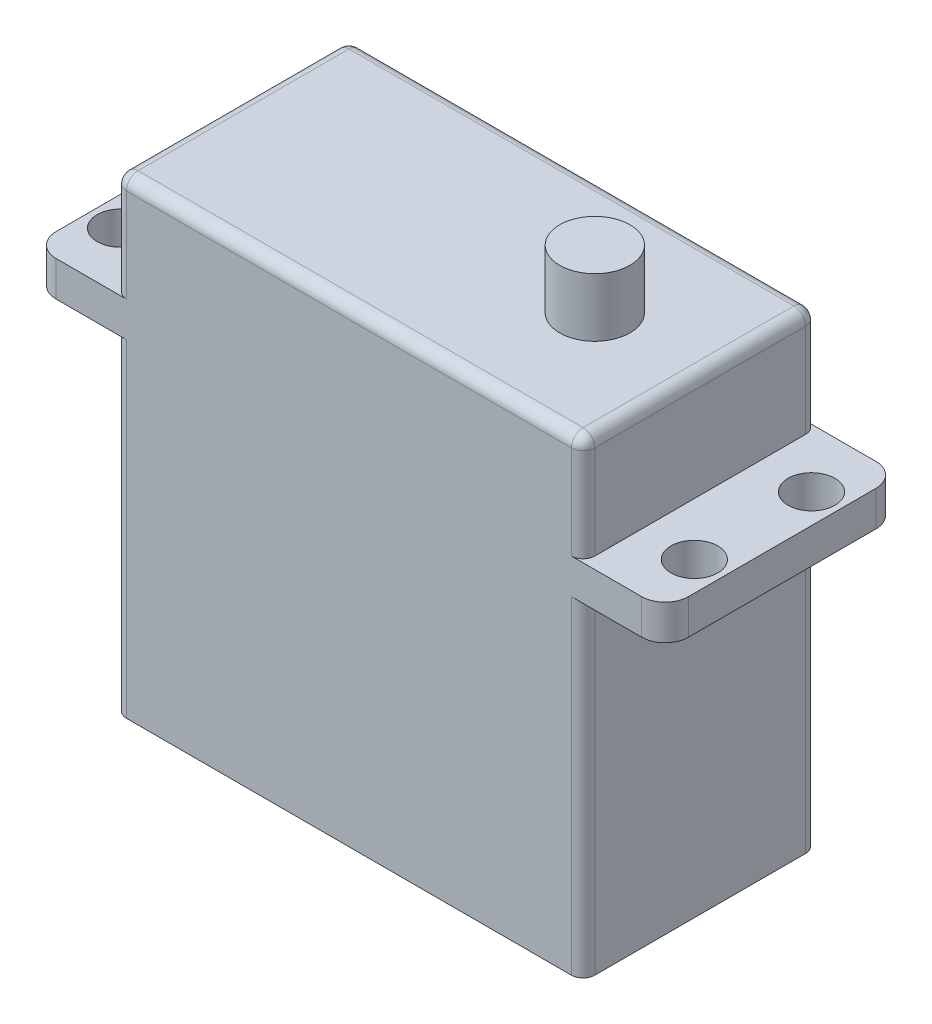
ISO-10303-21;
HEADER;
FILE_DESCRIPTION(('STEP AP214'),'2;1');
FILE_NAME('part.step','',(''),(''),'','','');
FILE_SCHEMA(('AUTOMOTIVE_DESIGN { 1 0 10303 214 1 1 1 1 }'));
ENDSEC;
DATA;
#1=APPLICATION_CONTEXT('core data for automotive mechanical design processes');
#2=APPLICATION_PROTOCOL_DEFINITION('international standard','automotive_design',2000,#1);
#3=PRODUCT_CONTEXT('',#1,'mechanical');
#4=PRODUCT('Part','Part','',(#3));
#5=PRODUCT_RELATED_PRODUCT_CATEGORY('part','',(#4));
#6=PRODUCT_DEFINITION_FORMATION('','',#4);
#7=PRODUCT_DEFINITION_CONTEXT('part definition',#1,'design');
#8=PRODUCT_DEFINITION('design','',#6,#7);
#9=PRODUCT_DEFINITION_SHAPE('','',#8);
#10=(LENGTH_UNIT() NAMED_UNIT(*) SI_UNIT(.MILLI.,.METRE.));
#11=(NAMED_UNIT(*) PLANE_ANGLE_UNIT() SI_UNIT($,.RADIAN.));
#12=(NAMED_UNIT(*) SI_UNIT($,.STERADIAN.) SOLID_ANGLE_UNIT());
#13=UNCERTAINTY_MEASURE_WITH_UNIT(LENGTH_MEASURE(1.E-05),#10,'distance_accuracy_value','');
#14=(GEOMETRIC_REPRESENTATION_CONTEXT(3) GLOBAL_UNCERTAINTY_ASSIGNED_CONTEXT((#13)) GLOBAL_UNIT_ASSIGNED_CONTEXT((#10,
#11,#12)) REPRESENTATION_CONTEXT('',''));
#15=CARTESIAN_POINT('',(0.,0.,0.));
#16=DIRECTION('',(0.,0.,1.));
#17=DIRECTION('',(1.,0.,0.));
#18=AXIS2_PLACEMENT_3D('',#15,#16,#17);
#19=CARTESIAN_POINT('',(20.,14.,20.));
#20=DIRECTION('',(-1.,0.,0.));
#21=DIRECTION('',(0.,-1.,0.));
#22=AXIS2_PLACEMENT_3D('',#19,#20,#21);
#23=PLANE('',#22);
#24=DIRECTION('',(0.,0.,-1.));
#25=VECTOR('',#24,1.);
#26=CARTESIAN_POINT('',(20.,-14.,20.));
#27=LINE('',#26,#25);
#28=CARTESIAN_POINT('',(20.,-14.,19.));
#29=VERTEX_POINT('',#28);
#30=CARTESIAN_POINT('',(20.,-14.,1.));
#31=VERTEX_POINT('',#30);
#32=EDGE_CURVE('E446',#29,#31,#27,.T.);
#33=ORIENTED_EDGE('',*,*,#32,.T.);
#34=DIRECTION('',(0.,1.,0.));
#35=VECTOR('',#34,1.);
#36=CARTESIAN_POINT('',(20.,14.,1.));
#37=LINE('',#36,#35);
#38=CARTESIAN_POINT('',(20.,14.,1.));
#39=VERTEX_POINT('',#38);
#40=EDGE_CURVE('E346',#31,#39,#37,.T.);
#41=ORIENTED_EDGE('',*,*,#40,.T.);
#42=DIRECTION('',(0.,0.,-1.));
#43=VECTOR('',#42,1.);
#44=CARTESIAN_POINT('',(20.,14.,20.));
#45=LINE('',#44,#43);
#46=CARTESIAN_POINT('',(20.,14.,19.));
#47=VERTEX_POINT('',#46);
#48=EDGE_CURVE('E251',#47,#39,#45,.T.);
#49=ORIENTED_EDGE('',*,*,#48,.F.);
#50=DIRECTION('',(0.,1.,0.));
#51=VECTOR('',#50,1.);
#52=CARTESIAN_POINT('',(20.,14.,19.));
#53=LINE('',#52,#51);
#54=EDGE_CURVE('E347',#47,#29,#53,.F.);
#55=ORIENTED_EDGE('',*,*,#54,.T.);
#56=EDGE_LOOP('',(#33,#41,#49,#55));
#57=FACE_BOUND('',#56,.T.);
#58=ADVANCED_FACE('F47',(#57),#23,.F.);
#59=CARTESIAN_POINT('',(20.,14.,20.));
#60=DIRECTION('',(0.,1.,0.));
#61=DIRECTION('',(0.,0.,1.));
#62=AXIS2_PLACEMENT_3D('',#59,#60,#61);
#63=PLANE('',#62);
#64=CARTESIAN_POINT('',(24.5,14.,5.));
#65=DIRECTION('',(0.,1.,0.));
#66=DIRECTION('',(0.,0.,1.));
#67=AXIS2_PLACEMENT_3D('',#64,#65,#66);
#68=CIRCLE('',#67,2.);
#69=CARTESIAN_POINT('',(24.5,14.,7.));
#70=VERTEX_POINT('',#69);
#71=EDGE_CURVE('E429',#70,#70,#68,.F.);
#72=ORIENTED_EDGE('',*,*,#71,.F.);
#73=EDGE_LOOP('',(#72));
#74=FACE_BOUND('',#73,.T.);
#75=CARTESIAN_POINT('',(24.5,14.,15.));
#76=DIRECTION('',(0.,1.,0.));
#77=DIRECTION('',(0.,0.,1.));
#78=AXIS2_PLACEMENT_3D('',#75,#76,#77);
#79=CIRCLE('',#78,2.);
#80=CARTESIAN_POINT('',(24.5,14.,17.));
#81=VERTEX_POINT('',#80);
#82=EDGE_CURVE('E1172',#81,#81,#79,.F.);
#83=ORIENTED_EDGE('',*,*,#82,.F.);
#84=EDGE_LOOP('',(#83));
#85=FACE_BOUND('',#84,.T.);
#86=DIRECTION('',(1.,0.,0.));
#87=VECTOR('',#86,1.);
#88=CARTESIAN_POINT('',(20.,14.,0.));
#89=LINE('',#88,#87);
#90=CARTESIAN_POINT('',(19.,14.,0.));
#91=VERTEX_POINT('',#90);
#92=CARTESIAN_POINT('',(25.,14.,0.));
#93=VERTEX_POINT('',#92);
#94=EDGE_CURVE('E423',#91,#93,#89,.T.);
#95=ORIENTED_EDGE('',*,*,#94,.T.);
#96=CARTESIAN_POINT('',(25.,14.,2.));
#97=DIRECTION('',(0.,1.,0.));
#98=DIRECTION('',(0.,0.,1.));
#99=AXIS2_PLACEMENT_3D('',#96,#97,#98);
#100=CIRCLE('',#99,2.);
#101=CARTESIAN_POINT('',(27.,14.,2.));
#102=VERTEX_POINT('',#101);
#103=EDGE_CURVE('E270',#93,#102,#100,.F.);
#104=ORIENTED_EDGE('',*,*,#103,.T.);
#105=DIRECTION('',(0.,0.,-1.));
#106=VECTOR('',#105,1.);
#107=CARTESIAN_POINT('',(27.,14.,20.));
#108=LINE('',#107,#106);
#109=CARTESIAN_POINT('',(27.,14.,18.));
#110=VERTEX_POINT('',#109);
#111=EDGE_CURVE('E250',#110,#102,#108,.T.);
#112=ORIENTED_EDGE('',*,*,#111,.F.);
#113=CARTESIAN_POINT('',(25.,14.,18.));
#114=DIRECTION('',(0.,1.,0.));
#115=DIRECTION('',(0.,0.,1.));
#116=AXIS2_PLACEMENT_3D('',#113,#114,#115);
#117=CIRCLE('',#116,2.);
#118=CARTESIAN_POINT('',(25.,14.,20.));
#119=VERTEX_POINT('',#118);
#120=EDGE_CURVE('E252',#110,#119,#117,.F.);
#121=ORIENTED_EDGE('',*,*,#120,.T.);
#122=DIRECTION('',(1.,0.,0.));
#123=VECTOR('',#122,1.);
#124=CARTESIAN_POINT('',(20.,14.,20.));
#125=LINE('',#124,#123);
#126=CARTESIAN_POINT('',(19.,14.,20.));
#127=VERTEX_POINT('',#126);
#128=EDGE_CURVE('E434',#127,#119,#125,.T.);
#129=ORIENTED_EDGE('',*,*,#128,.F.);
#130=CARTESIAN_POINT('',(19.,14.,19.));
#131=DIRECTION('',(0.,1.,0.));
#132=DIRECTION('',(0.,0.,1.));
#133=AXIS2_PLACEMENT_3D('',#130,#131,#132);
#134=CIRCLE('',#133,1.);
#135=EDGE_CURVE('E74',#127,#47,#134,.T.);
#136=ORIENTED_EDGE('',*,*,#135,.T.);
#137=ORIENTED_EDGE('',*,*,#48,.T.);
#138=CARTESIAN_POINT('',(19.,14.,1.));
#139=DIRECTION('',(0.,1.,0.));
#140=DIRECTION('',(0.,0.,1.));
#141=AXIS2_PLACEMENT_3D('',#138,#139,#140);
#142=CIRCLE('',#141,1.);
#143=EDGE_CURVE('E66',#39,#91,#142,.T.);
#144=ORIENTED_EDGE('',*,*,#143,.T.);
#145=EDGE_LOOP('',(#95,#104,#112,#121,#129,#136,#137,#144));
#146=FACE_BOUND('',#145,.T.);
#147=ADVANCED_FACE('F522',(#74,#85,#146),#63,.F.);
#148=CARTESIAN_POINT('',(27.,14.,20.));
#149=DIRECTION('',(-1.,0.,0.));
#150=DIRECTION('',(0.,0.,1.));
#151=AXIS2_PLACEMENT_3D('',#148,#149,#150);
#152=PLANE('',#151);
#153=ORIENTED_EDGE('',*,*,#111,.T.);
#154=DIRECTION('',(0.,1.,0.));
#155=VECTOR('',#154,1.);
#156=CARTESIAN_POINT('',(27.,17.,2.));
#157=LINE('',#156,#155);
#158=CARTESIAN_POINT('',(27.,17.,2.));
#159=VERTEX_POINT('',#158);
#160=EDGE_CURVE('E236',#102,#159,#157,.T.);
#161=ORIENTED_EDGE('',*,*,#160,.T.);
#162=DIRECTION('',(0.,0.,-1.));
#163=VECTOR('',#162,1.);
#164=CARTESIAN_POINT('',(27.,17.,20.));
#165=LINE('',#164,#163);
#166=CARTESIAN_POINT('',(27.,17.,18.));
#167=VERTEX_POINT('',#166);
#168=EDGE_CURVE('E227',#167,#159,#165,.T.);
#169=ORIENTED_EDGE('',*,*,#168,.F.);
#170=DIRECTION('',(0.,1.,0.));
#171=VECTOR('',#170,1.);
#172=CARTESIAN_POINT('',(27.,14.,18.));
#173=LINE('',#172,#171);
#174=EDGE_CURVE('E244',#167,#110,#173,.F.);
#175=ORIENTED_EDGE('',*,*,#174,.T.);
#176=EDGE_LOOP('',(#153,#161,#169,#175));
#177=FACE_BOUND('',#176,.T.);
#178=ADVANCED_FACE('F241',(#177),#152,.F.);
#179=CARTESIAN_POINT('',(20.,17.,20.));
#180=DIRECTION('',(0.,-1.,0.));
#181=DIRECTION('',(0.,0.,-1.));
#182=AXIS2_PLACEMENT_3D('',#179,#180,#181);
#183=PLANE('',#182);
#184=CARTESIAN_POINT('',(24.5,17.,5.));
#185=DIRECTION('',(0.,-1.,0.));
#186=DIRECTION('',(0.,0.,1.));
#187=AXIS2_PLACEMENT_3D('',#184,#185,#186);
#188=CIRCLE('',#187,2.);
#189=CARTESIAN_POINT('',(24.5,17.,7.));
#190=VERTEX_POINT('',#189);
#191=EDGE_CURVE('E1170',#190,#190,#188,.T.);
#192=ORIENTED_EDGE('',*,*,#191,.T.);
#193=EDGE_LOOP('',(#192));
#194=FACE_BOUND('',#193,.T.);
#195=CARTESIAN_POINT('',(24.5,17.,15.));
#196=DIRECTION('',(0.,-1.,0.));
#197=DIRECTION('',(0.,0.,1.));
#198=AXIS2_PLACEMENT_3D('',#195,#196,#197);
#199=CIRCLE('',#198,2.);
#200=CARTESIAN_POINT('',(24.5,17.,17.));
#201=VERTEX_POINT('',#200);
#202=EDGE_CURVE('E380',#201,#201,#199,.T.);
#203=ORIENTED_EDGE('',*,*,#202,.T.);
#204=EDGE_LOOP('',(#203));
#205=FACE_BOUND('',#204,.T.);
#206=ORIENTED_EDGE('',*,*,#168,.T.);
#207=CARTESIAN_POINT('',(25.,17.,2.));
#208=DIRECTION('',(0.,-1.,0.));
#209=DIRECTION('',(0.,0.,-1.));
#210=AXIS2_PLACEMENT_3D('',#207,#208,#209);
#211=CIRCLE('',#210,2.);
#212=CARTESIAN_POINT('',(25.,17.,0.));
#213=VERTEX_POINT('',#212);
#214=EDGE_CURVE('E240',#159,#213,#211,.F.);
#215=ORIENTED_EDGE('',*,*,#214,.T.);
#216=DIRECTION('',(-1.,0.,0.));
#217=VECTOR('',#216,1.);
#218=CARTESIAN_POINT('',(20.,17.,0.));
#219=LINE('',#218,#217);
#220=CARTESIAN_POINT('',(19.,17.,0.));
#221=VERTEX_POINT('',#220);
#222=EDGE_CURVE('E451',#213,#221,#219,.T.);
#223=ORIENTED_EDGE('',*,*,#222,.T.);
#224=CARTESIAN_POINT('',(19.,17.,1.));
#225=DIRECTION('',(0.,-1.,0.));
#226=DIRECTION('',(0.,0.,-1.));
#227=AXIS2_PLACEMENT_3D('',#224,#225,#226);
#228=CIRCLE('',#227,1.);
#229=CARTESIAN_POINT('',(20.,17.,1.));
#230=VERTEX_POINT('',#229);
#231=EDGE_CURVE('E360',#221,#230,#228,.T.);
#232=ORIENTED_EDGE('',*,*,#231,.T.);
#233=DIRECTION('',(0.,0.,-1.));
#234=VECTOR('',#233,1.);
#235=CARTESIAN_POINT('',(20.,17.,20.));
#236=LINE('',#235,#234);
#237=CARTESIAN_POINT('',(20.,17.,19.));
#238=VERTEX_POINT('',#237);
#239=EDGE_CURVE('E247',#238,#230,#236,.T.);
#240=ORIENTED_EDGE('',*,*,#239,.F.);
#241=CARTESIAN_POINT('',(19.,17.,19.));
#242=DIRECTION('',(0.,-1.,0.));
#243=DIRECTION('',(0.,0.,-1.));
#244=AXIS2_PLACEMENT_3D('',#241,#242,#243);
#245=CIRCLE('',#244,1.);
#246=CARTESIAN_POINT('',(19.,17.,20.));
#247=VERTEX_POINT('',#246);
#248=EDGE_CURVE('E359',#238,#247,#245,.T.);
#249=ORIENTED_EDGE('',*,*,#248,.T.);
#250=DIRECTION('',(-1.,0.,0.));
#251=VECTOR('',#250,1.);
#252=CARTESIAN_POINT('',(20.,17.,20.));
#253=LINE('',#252,#251);
#254=CARTESIAN_POINT('',(25.,17.,20.));
#255=VERTEX_POINT('',#254);
#256=EDGE_CURVE('E235',#255,#247,#253,.T.);
#257=ORIENTED_EDGE('',*,*,#256,.F.);
#258=CARTESIAN_POINT('',(25.,17.,18.));
#259=DIRECTION('',(0.,-1.,0.));
#260=DIRECTION('',(0.,0.,-1.));
#261=AXIS2_PLACEMENT_3D('',#258,#259,#260);
#262=CIRCLE('',#261,2.);
#263=EDGE_CURVE('E230',#255,#167,#262,.F.);
#264=ORIENTED_EDGE('',*,*,#263,.T.);
#265=EDGE_LOOP('',(#206,#215,#223,#232,#240,#249,#257,#264));
#266=FACE_BOUND('',#265,.T.);
#267=ADVANCED_FACE('F229',(#194,#205,#266),#183,.F.);
#268=CARTESIAN_POINT('',(20.,17.,20.));
#269=DIRECTION('',(-1.,0.,0.));
#270=DIRECTION('',(0.,0.,1.));
#271=AXIS2_PLACEMENT_3D('',#268,#269,#270);
#272=PLANE('',#271);
#273=ORIENTED_EDGE('',*,*,#239,.T.);
#274=DIRECTION('',(0.,1.,0.));
#275=VECTOR('',#274,1.);
#276=CARTESIAN_POINT('',(20.,25.,1.));
#277=LINE('',#276,#275);
#278=CARTESIAN_POINT('',(20.,25.,1.));
#279=VERTEX_POINT('',#278);
#280=EDGE_CURVE('E343',#230,#279,#277,.T.);
#281=ORIENTED_EDGE('',*,*,#280,.T.);
#282=DIRECTION('',(0.,0.,-1.));
#283=VECTOR('',#282,1.);
#284=CARTESIAN_POINT('',(20.,25.,20.));
#285=LINE('',#284,#283);
#286=CARTESIAN_POINT('',(20.,25.,19.));
#287=VERTEX_POINT('',#286);
#288=EDGE_CURVE('E410',#287,#279,#285,.T.);
#289=ORIENTED_EDGE('',*,*,#288,.F.);
#290=DIRECTION('',(0.,1.,0.));
#291=VECTOR('',#290,1.);
#292=CARTESIAN_POINT('',(20.,17.,19.));
#293=LINE('',#292,#291);
#294=EDGE_CURVE('E345',#287,#238,#293,.F.);
#295=ORIENTED_EDGE('',*,*,#294,.T.);
#296=EDGE_LOOP('',(#273,#281,#289,#295));
#297=FACE_BOUND('',#296,.T.);
#298=ADVANCED_FACE('F404',(#297),#272,.F.);
#299=CARTESIAN_POINT('',(19.,25.,20.));
#300=DIRECTION('',(0.,0.,-1.));
#301=DIRECTION('',(-1.,0.,0.));
#302=AXIS2_PLACEMENT_3D('',#299,#300,#301);
#303=CYLINDRICAL_SURFACE('',#302,1.);
#304=ORIENTED_EDGE('',*,*,#288,.T.);
#305=CARTESIAN_POINT('',(19.,25.,1.));
#306=DIRECTION('',(0.,0.,-1.));
#307=DIRECTION('',(-1.,0.,0.));
#308=AXIS2_PLACEMENT_3D('',#305,#306,#307);
#309=CIRCLE('',#308,1.);
#310=CARTESIAN_POINT('',(19.,26.,1.));
#311=VERTEX_POINT('',#310);
#312=EDGE_CURVE('E314',#279,#311,#309,.F.);
#313=ORIENTED_EDGE('',*,*,#312,.T.);
#314=DIRECTION('',(0.,0.,-1.));
#315=VECTOR('',#314,1.);
#316=CARTESIAN_POINT('',(19.,26.,20.));
#317=LINE('',#316,#315);
#318=CARTESIAN_POINT('',(19.,26.,19.));
#319=VERTEX_POINT('',#318);
#320=EDGE_CURVE('E411',#319,#311,#317,.T.);
#321=ORIENTED_EDGE('',*,*,#320,.F.);
#322=CARTESIAN_POINT('',(19.,25.,19.));
#323=DIRECTION('',(0.,0.,-1.));
#324=DIRECTION('',(-1.,0.,0.));
#325=AXIS2_PLACEMENT_3D('',#322,#323,#324);
#326=CIRCLE('',#325,1.);
#327=EDGE_CURVE('E315',#319,#287,#326,.T.);
#328=ORIENTED_EDGE('',*,*,#327,.T.);
#329=EDGE_LOOP('',(#304,#313,#321,#328));
#330=FACE_BOUND('',#329,.T.);
#331=ADVANCED_FACE('F546',(#330),#303,.T.);
#332=CARTESIAN_POINT('',(-19.,26.,20.));
#333=DIRECTION('',(0.,-1.,0.));
#334=DIRECTION('',(0.,0.,-1.));
#335=AXIS2_PLACEMENT_3D('',#332,#333,#334);
#336=PLANE('',#335);
#337=CARTESIAN_POINT('',(11.,26.,10.));
#338=DIRECTION('',(0.,1.,0.));
#339=DIRECTION('',(0.,0.,1.));
#340=AXIS2_PLACEMENT_3D('',#337,#338,#339);
#341=CIRCLE('',#340,3.);
#342=CARTESIAN_POINT('',(11.,26.,13.));
#343=VERTEX_POINT('',#342);
#344=EDGE_CURVE('E11',#343,#343,#341,.T.);
#345=ORIENTED_EDGE('',*,*,#344,.F.);
#346=EDGE_LOOP('',(#345));
#347=FACE_BOUND('',#346,.T.);
#348=ORIENTED_EDGE('',*,*,#320,.T.);
#349=DIRECTION('',(-1.,0.,0.));
#350=VECTOR('',#349,1.);
#351=CARTESIAN_POINT('',(-19.,26.,1.));
#352=LINE('',#351,#350);
#353=CARTESIAN_POINT('',(-19.,26.,1.));
#354=VERTEX_POINT('',#353);
#355=EDGE_CURVE('E309',#311,#354,#352,.T.);
#356=ORIENTED_EDGE('',*,*,#355,.T.);
#357=DIRECTION('',(0.,0.,-1.));
#358=VECTOR('',#357,1.);
#359=CARTESIAN_POINT('',(-19.,26.,20.));
#360=LINE('',#359,#358);
#361=CARTESIAN_POINT('',(-19.,26.,19.));
#362=VERTEX_POINT('',#361);
#363=EDGE_CURVE('E477',#362,#354,#360,.T.);
#364=ORIENTED_EDGE('',*,*,#363,.F.);
#365=DIRECTION('',(-1.,0.,0.));
#366=VECTOR('',#365,1.);
#367=CARTESIAN_POINT('',(-19.,26.,19.));
#368=LINE('',#367,#366);
#369=EDGE_CURVE('E306',#362,#319,#368,.F.);
#370=ORIENTED_EDGE('',*,*,#369,.T.);
#371=EDGE_LOOP('',(#348,#356,#364,#370));
#372=FACE_BOUND('',#371,.T.);
#373=ADVANCED_FACE('F486',(#347,#372),#336,.F.);
#374=CARTESIAN_POINT('',(-19.,25.,20.));
#375=DIRECTION('',(0.,0.,-1.));
#376=DIRECTION('',(-1.,0.,0.));
#377=AXIS2_PLACEMENT_3D('',#374,#375,#376);
#378=CYLINDRICAL_SURFACE('',#377,1.);
#379=ORIENTED_EDGE('',*,*,#363,.T.);
#380=CARTESIAN_POINT('',(-19.,25.,1.));
#381=DIRECTION('',(0.,0.,-1.));
#382=DIRECTION('',(-1.,0.,0.));
#383=AXIS2_PLACEMENT_3D('',#380,#381,#382);
#384=CIRCLE('',#383,1.);
#385=CARTESIAN_POINT('',(-20.,25.,1.));
#386=VERTEX_POINT('',#385);
#387=EDGE_CURVE('E308',#354,#386,#384,.F.);
#388=ORIENTED_EDGE('',*,*,#387,.T.);
#389=DIRECTION('',(0.,0.,-1.));
#390=VECTOR('',#389,1.);
#391=CARTESIAN_POINT('',(-20.,25.,20.));
#392=LINE('',#391,#390);
#393=CARTESIAN_POINT('',(-20.,25.,19.));
#394=VERTEX_POINT('',#393);
#395=EDGE_CURVE('E480',#394,#386,#392,.T.);
#396=ORIENTED_EDGE('',*,*,#395,.F.);
#397=CARTESIAN_POINT('',(-19.,25.,19.));
#398=DIRECTION('',(0.,0.,-1.));
#399=DIRECTION('',(-1.,0.,0.));
#400=AXIS2_PLACEMENT_3D('',#397,#398,#399);
#401=CIRCLE('',#400,1.);
#402=EDGE_CURVE('E303',#394,#362,#401,.T.);
#403=ORIENTED_EDGE('',*,*,#402,.T.);
#404=EDGE_LOOP('',(#379,#388,#396,#403));
#405=FACE_BOUND('',#404,.T.);
#406=ADVANCED_FACE('F502',(#405),#378,.T.);
#407=CARTESIAN_POINT('',(-20.,17.,20.));
#408=DIRECTION('',(1.,0.,0.));
#409=DIRECTION('',(0.,0.,-1.));
#410=AXIS2_PLACEMENT_3D('',#407,#408,#409);
#411=PLANE('',#410);
#412=ORIENTED_EDGE('',*,*,#395,.T.);
#413=DIRECTION('',(0.,-1.,0.));
#414=VECTOR('',#413,1.);
#415=CARTESIAN_POINT('',(-20.,17.,1.));
#416=LINE('',#415,#414);
#417=CARTESIAN_POINT('',(-20.,17.,1.));
#418=VERTEX_POINT('',#417);
#419=EDGE_CURVE('E288',#386,#418,#416,.T.);
#420=ORIENTED_EDGE('',*,*,#419,.T.);
#421=DIRECTION('',(0.,0.,-1.));
#422=VECTOR('',#421,1.);
#423=CARTESIAN_POINT('',(-20.,17.,20.));
#424=LINE('',#423,#422);
#425=CARTESIAN_POINT('',(-20.,17.,19.));
#426=VERTEX_POINT('',#425);
#427=EDGE_CURVE('E475',#426,#418,#424,.T.);
#428=ORIENTED_EDGE('',*,*,#427,.F.);
#429=DIRECTION('',(0.,-1.,0.));
#430=VECTOR('',#429,1.);
#431=CARTESIAN_POINT('',(-20.,17.,19.));
#432=LINE('',#431,#430);
#433=EDGE_CURVE('E290',#426,#394,#432,.F.);
#434=ORIENTED_EDGE('',*,*,#433,.T.);
#435=EDGE_LOOP('',(#412,#420,#428,#434));
#436=FACE_BOUND('',#435,.T.);
#437=ADVANCED_FACE('F507',(#436),#411,.F.);
#438=CARTESIAN_POINT('',(-27.,17.,20.));
#439=DIRECTION('',(0.,-1.,0.));
#440=DIRECTION('',(0.,0.,-1.));
#441=AXIS2_PLACEMENT_3D('',#438,#439,#440);
#442=PLANE('',#441);
#443=CARTESIAN_POINT('',(-24.5,17.,5.));
#444=DIRECTION('',(0.,1.,0.));
#445=DIRECTION('',(0.,0.,1.));
#446=AXIS2_PLACEMENT_3D('',#443,#444,#445);
#447=CIRCLE('',#446,2.);
#448=CARTESIAN_POINT('',(-24.5,17.,7.));
#449=VERTEX_POINT('',#448);
#450=EDGE_CURVE('E417',#449,#449,#447,.T.);
#451=ORIENTED_EDGE('',*,*,#450,.F.);
#452=EDGE_LOOP('',(#451));
#453=FACE_BOUND('',#452,.T.);
#454=CARTESIAN_POINT('',(-24.5,17.,15.));
#455=DIRECTION('',(0.,1.,0.));
#456=DIRECTION('',(0.,0.,1.));
#457=AXIS2_PLACEMENT_3D('',#454,#455,#456);
#458=CIRCLE('',#457,2.);
#459=CARTESIAN_POINT('',(-24.5,17.,17.));
#460=VERTEX_POINT('',#459);
#461=EDGE_CURVE('E424',#460,#460,#458,.T.);
#462=ORIENTED_EDGE('',*,*,#461,.F.);
#463=EDGE_LOOP('',(#462));
#464=FACE_BOUND('',#463,.T.);
#465=DIRECTION('',(-1.,0.,0.));
#466=VECTOR('',#465,1.);
#467=CARTESIAN_POINT('',(-27.,17.,0.));
#468=LINE('',#467,#466);
#469=CARTESIAN_POINT('',(-19.,17.,0.));
#470=VERTEX_POINT('',#469);
#471=CARTESIAN_POINT('',(-25.,17.,0.));
#472=VERTEX_POINT('',#471);
#473=EDGE_CURVE('E452',#470,#472,#468,.T.);
#474=ORIENTED_EDGE('',*,*,#473,.T.);
#475=CARTESIAN_POINT('',(-25.,17.,2.));
#476=DIRECTION('',(0.,-1.,0.));
#477=DIRECTION('',(0.,0.,-1.));
#478=AXIS2_PLACEMENT_3D('',#475,#476,#477);
#479=CIRCLE('',#478,2.);
#480=CARTESIAN_POINT('',(-27.,17.,2.));
#481=VERTEX_POINT('',#480);
#482=EDGE_CURVE('E282',#472,#481,#479,.F.);
#483=ORIENTED_EDGE('',*,*,#482,.T.);
#484=DIRECTION('',(0.,0.,-1.));
#485=VECTOR('',#484,1.);
#486=CARTESIAN_POINT('',(-27.,17.,20.));
#487=LINE('',#486,#485);
#488=CARTESIAN_POINT('',(-27.,17.,18.));
#489=VERTEX_POINT('',#488);
#490=EDGE_CURVE('E473',#489,#481,#487,.T.);
#491=ORIENTED_EDGE('',*,*,#490,.F.);
#492=CARTESIAN_POINT('',(-25.,17.,18.));
#493=DIRECTION('',(0.,-1.,0.));
#494=DIRECTION('',(0.,0.,-1.));
#495=AXIS2_PLACEMENT_3D('',#492,#493,#494);
#496=CIRCLE('',#495,2.);
#497=CARTESIAN_POINT('',(-25.,17.,20.));
#498=VERTEX_POINT('',#497);
#499=EDGE_CURVE('E281',#489,#498,#496,.F.);
#500=ORIENTED_EDGE('',*,*,#499,.T.);
#501=DIRECTION('',(-1.,0.,0.));
#502=VECTOR('',#501,1.);
#503=CARTESIAN_POINT('',(-27.,17.,20.));
#504=LINE('',#503,#502);
#505=CARTESIAN_POINT('',(-19.,17.,20.));
#506=VERTEX_POINT('',#505);
#507=EDGE_CURVE('E439',#506,#498,#504,.T.);
#508=ORIENTED_EDGE('',*,*,#507,.F.);
#509=CARTESIAN_POINT('',(-19.,17.,19.));
#510=DIRECTION('',(0.,-1.,0.));
#511=DIRECTION('',(0.,0.,-1.));
#512=AXIS2_PLACEMENT_3D('',#509,#510,#511);
#513=CIRCLE('',#512,1.);
#514=EDGE_CURVE('E351',#506,#426,#513,.T.);
#515=ORIENTED_EDGE('',*,*,#514,.T.);
#516=ORIENTED_EDGE('',*,*,#427,.T.);
#517=CARTESIAN_POINT('',(-19.,17.,1.));
#518=DIRECTION('',(0.,-1.,0.));
#519=DIRECTION('',(0.,0.,-1.));
#520=AXIS2_PLACEMENT_3D('',#517,#518,#519);
#521=CIRCLE('',#520,1.);
#522=EDGE_CURVE('E348',#418,#470,#521,.T.);
#523=ORIENTED_EDGE('',*,*,#522,.T.);
#524=EDGE_LOOP('',(#474,#483,#491,#500,#508,#515,#516,#523));
#525=FACE_BOUND('',#524,.T.);
#526=ADVANCED_FACE('F638',(#453,#464,#525),#442,.F.);
#527=CARTESIAN_POINT('',(-27.,14.,20.));
#528=DIRECTION('',(1.,0.,0.));
#529=DIRECTION('',(0.,0.,-1.));
#530=AXIS2_PLACEMENT_3D('',#527,#528,#529);
#531=PLANE('',#530);
#532=ORIENTED_EDGE('',*,*,#490,.T.);
#533=DIRECTION('',(0.,-1.,0.));
#534=VECTOR('',#533,1.);
#535=CARTESIAN_POINT('',(-27.,14.,2.));
#536=LINE('',#535,#534);
#537=CARTESIAN_POINT('',(-27.,14.,2.));
#538=VERTEX_POINT('',#537);
#539=EDGE_CURVE('E277',#481,#538,#536,.T.);
#540=ORIENTED_EDGE('',*,*,#539,.T.);
#541=DIRECTION('',(0.,0.,-1.));
#542=VECTOR('',#541,1.);
#543=CARTESIAN_POINT('',(-27.,14.,20.));
#544=LINE('',#543,#542);
#545=CARTESIAN_POINT('',(-27.,14.,18.));
#546=VERTEX_POINT('',#545);
#547=EDGE_CURVE('E467',#546,#538,#544,.T.);
#548=ORIENTED_EDGE('',*,*,#547,.F.);
#549=DIRECTION('',(0.,-1.,0.));
#550=VECTOR('',#549,1.);
#551=CARTESIAN_POINT('',(-27.,14.,18.));
#552=LINE('',#551,#550);
#553=EDGE_CURVE('E273',#546,#489,#552,.F.);
#554=ORIENTED_EDGE('',*,*,#553,.T.);
#555=EDGE_LOOP('',(#532,#540,#548,#554));
#556=FACE_BOUND('',#555,.T.);
#557=ADVANCED_FACE('F640',(#556),#531,.F.);
#558=CARTESIAN_POINT('',(-27.,14.,20.));
#559=DIRECTION('',(0.,1.,0.));
#560=DIRECTION('',(0.,0.,1.));
#561=AXIS2_PLACEMENT_3D('',#558,#559,#560);
#562=PLANE('',#561);
#563=CARTESIAN_POINT('',(-24.5,14.,5.));
#564=DIRECTION('',(0.,1.,0.));
#565=DIRECTION('',(0.,0.,1.));
#566=AXIS2_PLACEMENT_3D('',#563,#564,#565);
#567=CIRCLE('',#566,2.);
#568=CARTESIAN_POINT('',(-24.5,14.,7.));
#569=VERTEX_POINT('',#568);
#570=EDGE_CURVE('E256',#569,#569,#567,.T.);
#571=ORIENTED_EDGE('',*,*,#570,.T.);
#572=EDGE_LOOP('',(#571));
#573=FACE_BOUND('',#572,.T.);
#574=CARTESIAN_POINT('',(-24.5,14.,15.));
#575=DIRECTION('',(0.,1.,0.));
#576=DIRECTION('',(0.,0.,1.));
#577=AXIS2_PLACEMENT_3D('',#574,#575,#576);
#578=CIRCLE('',#577,2.);
#579=CARTESIAN_POINT('',(-24.5,14.,17.));
#580=VERTEX_POINT('',#579);
#581=EDGE_CURVE('E414',#580,#580,#578,.T.);
#582=ORIENTED_EDGE('',*,*,#581,.T.);
#583=EDGE_LOOP('',(#582));
#584=FACE_BOUND('',#583,.T.);
#585=ORIENTED_EDGE('',*,*,#547,.T.);
#586=CARTESIAN_POINT('',(-25.,14.,2.));
#587=DIRECTION('',(0.,1.,0.));
#588=DIRECTION('',(0.,0.,1.));
#589=AXIS2_PLACEMENT_3D('',#586,#587,#588);
#590=CIRCLE('',#589,2.);
#591=CARTESIAN_POINT('',(-25.,14.,0.));
#592=VERTEX_POINT('',#591);
#593=EDGE_CURVE('E283',#538,#592,#590,.F.);
#594=ORIENTED_EDGE('',*,*,#593,.T.);
#595=DIRECTION('',(1.,0.,0.));
#596=VECTOR('',#595,1.);
#597=CARTESIAN_POINT('',(-27.,14.,0.));
#598=LINE('',#597,#596);
#599=CARTESIAN_POINT('',(-19.,14.,0.));
#600=VERTEX_POINT('',#599);
#601=EDGE_CURVE('E457',#592,#600,#598,.T.);
#602=ORIENTED_EDGE('',*,*,#601,.T.);
#603=CARTESIAN_POINT('',(-19.,14.,1.));
#604=DIRECTION('',(0.,1.,0.));
#605=DIRECTION('',(0.,0.,1.));
#606=AXIS2_PLACEMENT_3D('',#603,#604,#605);
#607=CIRCLE('',#606,1.);
#608=CARTESIAN_POINT('',(-20.,14.,1.));
#609=VERTEX_POINT('',#608);
#610=EDGE_CURVE('E352',#600,#609,#607,.T.);
#611=ORIENTED_EDGE('',*,*,#610,.T.);
#612=DIRECTION('',(0.,0.,-1.));
#613=VECTOR('',#612,1.);
#614=CARTESIAN_POINT('',(-20.,14.,20.));
#615=LINE('',#614,#613);
#616=CARTESIAN_POINT('',(-20.,14.,19.));
#617=VERTEX_POINT('',#616);
#618=EDGE_CURVE('E462',#617,#609,#615,.T.);
#619=ORIENTED_EDGE('',*,*,#618,.F.);
#620=CARTESIAN_POINT('',(-19.,14.,19.));
#621=DIRECTION('',(0.,1.,0.));
#622=DIRECTION('',(0.,0.,1.));
#623=AXIS2_PLACEMENT_3D('',#620,#621,#622);
#624=CIRCLE('',#623,1.);
#625=CARTESIAN_POINT('',(-19.,14.,20.));
#626=VERTEX_POINT('',#625);
#627=EDGE_CURVE('E59',#617,#626,#624,.T.);
#628=ORIENTED_EDGE('',*,*,#627,.T.);
#629=DIRECTION('',(1.,0.,0.));
#630=VECTOR('',#629,1.);
#631=CARTESIAN_POINT('',(-27.,14.,20.));
#632=LINE('',#631,#630);
#633=CARTESIAN_POINT('',(-25.,14.,20.));
#634=VERTEX_POINT('',#633);
#635=EDGE_CURVE('E444',#634,#626,#632,.T.);
#636=ORIENTED_EDGE('',*,*,#635,.F.);
#637=CARTESIAN_POINT('',(-25.,14.,18.));
#638=DIRECTION('',(0.,1.,0.));
#639=DIRECTION('',(0.,0.,1.));
#640=AXIS2_PLACEMENT_3D('',#637,#638,#639);
#641=CIRCLE('',#640,2.);
#642=EDGE_CURVE('E276',#634,#546,#641,.F.);
#643=ORIENTED_EDGE('',*,*,#642,.T.);
#644=EDGE_LOOP('',(#585,#594,#602,#611,#619,#628,#636,#643));
#645=FACE_BOUND('',#644,.T.);
#646=ADVANCED_FACE('F621',(#573,#584,#645),#562,.F.);
#647=CARTESIAN_POINT('',(-20.,14.,20.));
#648=DIRECTION('',(1.,0.,0.));
#649=DIRECTION('',(0.,1.,0.));
#650=AXIS2_PLACEMENT_3D('',#647,#648,#649);
#651=PLANE('',#650);
#652=ORIENTED_EDGE('',*,*,#618,.T.);
#653=DIRECTION('',(0.,-1.,0.));
#654=VECTOR('',#653,1.);
#655=CARTESIAN_POINT('',(-20.,-14.,1.));
#656=LINE('',#655,#654);
#657=CARTESIAN_POINT('',(-20.,-14.,1.));
#658=VERTEX_POINT('',#657);
#659=EDGE_CURVE('E332',#609,#658,#656,.T.);
#660=ORIENTED_EDGE('',*,*,#659,.T.);
#661=DIRECTION('',(0.,0.,-1.));
#662=VECTOR('',#661,1.);
#663=CARTESIAN_POINT('',(-20.,-14.,20.));
#664=LINE('',#663,#662);
#665=CARTESIAN_POINT('',(-20.,-14.,19.));
#666=VERTEX_POINT('',#665);
#667=EDGE_CURVE('E465',#666,#658,#664,.T.);
#668=ORIENTED_EDGE('',*,*,#667,.F.);
#669=DIRECTION('',(0.,-1.,0.));
#670=VECTOR('',#669,1.);
#671=CARTESIAN_POINT('',(-20.,14.,19.));
#672=LINE('',#671,#670);
#673=EDGE_CURVE('E328',#666,#617,#672,.F.);
#674=ORIENTED_EDGE('',*,*,#673,.T.);
#675=EDGE_LOOP('',(#652,#660,#668,#674));
#676=FACE_BOUND('',#675,.T.);
#677=ADVANCED_FACE('F630',(#676),#651,.F.);
#678=CARTESIAN_POINT('',(-20.,-14.,20.));
#679=DIRECTION('',(0.,1.,0.));
#680=DIRECTION('',(0.,0.,1.));
#681=AXIS2_PLACEMENT_3D('',#678,#679,#680);
#682=PLANE('',#681);
#683=ORIENTED_EDGE('',*,*,#667,.T.);
#684=CARTESIAN_POINT('',(-19.,-14.,1.));
#685=DIRECTION('',(0.,1.,0.));
#686=DIRECTION('',(0.,0.,1.));
#687=AXIS2_PLACEMENT_3D('',#684,#685,#686);
#688=CIRCLE('',#687,1.);
#689=CARTESIAN_POINT('',(-19.,-14.,0.));
#690=VERTEX_POINT('',#689);
#691=EDGE_CURVE('E337',#658,#690,#688,.F.);
#692=ORIENTED_EDGE('',*,*,#691,.T.);
#693=DIRECTION('',(1.,0.,0.));
#694=VECTOR('',#693,1.);
#695=CARTESIAN_POINT('',(-20.,-14.,0.));
#696=LINE('',#695,#694);
#697=CARTESIAN_POINT('',(19.,-14.,0.));
#698=VERTEX_POINT('',#697);
#699=EDGE_CURVE('E437',#690,#698,#696,.T.);
#700=ORIENTED_EDGE('',*,*,#699,.T.);
#701=CARTESIAN_POINT('',(19.,-14.,1.));
#702=DIRECTION('',(0.,1.,0.));
#703=DIRECTION('',(0.,0.,1.));
#704=AXIS2_PLACEMENT_3D('',#701,#702,#703);
#705=CIRCLE('',#704,1.);
#706=EDGE_CURVE('E336',#698,#31,#705,.F.);
#707=ORIENTED_EDGE('',*,*,#706,.T.);
#708=ORIENTED_EDGE('',*,*,#32,.F.);
#709=CARTESIAN_POINT('',(19.,-14.,19.));
#710=DIRECTION('',(0.,1.,0.));
#711=DIRECTION('',(0.,0.,1.));
#712=AXIS2_PLACEMENT_3D('',#709,#710,#711);
#713=CIRCLE('',#712,1.);
#714=CARTESIAN_POINT('',(19.,-14.,20.));
#715=VERTEX_POINT('',#714);
#716=EDGE_CURVE('E338',#29,#715,#713,.F.);
#717=ORIENTED_EDGE('',*,*,#716,.T.);
#718=DIRECTION('',(1.,0.,0.));
#719=VECTOR('',#718,1.);
#720=CARTESIAN_POINT('',(-20.,-14.,20.));
#721=LINE('',#720,#719);
#722=CARTESIAN_POINT('',(-19.,-14.,20.));
#723=VERTEX_POINT('',#722);
#724=EDGE_CURVE('E443',#723,#715,#721,.T.);
#725=ORIENTED_EDGE('',*,*,#724,.F.);
#726=CARTESIAN_POINT('',(-19.,-14.,19.));
#727=DIRECTION('',(0.,1.,0.));
#728=DIRECTION('',(0.,0.,1.));
#729=AXIS2_PLACEMENT_3D('',#726,#727,#728);
#730=CIRCLE('',#729,1.);
#731=EDGE_CURVE('E331',#723,#666,#730,.F.);
#732=ORIENTED_EDGE('',*,*,#731,.T.);
#733=EDGE_LOOP('',(#683,#692,#700,#707,#708,#717,#725,#732));
#734=FACE_BOUND('',#733,.T.);
#735=ADVANCED_FACE('F533',(#734),#682,.F.);
#736=CARTESIAN_POINT('',(-19.,25.,20.));
#737=DIRECTION('',(0.,0.,-1.));
#738=DIRECTION('',(-1.,0.,0.));
#739=AXIS2_PLACEMENT_3D('',#736,#737,#738);
#740=PLANE('',#739);
#741=DIRECTION('',(0.,-1.,0.));
#742=VECTOR('',#741,1.);
#743=CARTESIAN_POINT('',(-19.,25.,20.));
#744=LINE('',#743,#742);
#745=CARTESIAN_POINT('',(-19.,25.,20.));
#746=VERTEX_POINT('',#745);
#747=EDGE_CURVE('E326',#746,#506,#744,.T.);
#748=ORIENTED_EDGE('',*,*,#747,.T.);
#749=ORIENTED_EDGE('',*,*,#507,.T.);
#750=DIRECTION('',(0.,-1.,0.));
#751=VECTOR('',#750,1.);
#752=CARTESIAN_POINT('',(-25.,25.,20.));
#753=LINE('',#752,#751);
#754=EDGE_CURVE('E267',#498,#634,#753,.T.);
#755=ORIENTED_EDGE('',*,*,#754,.T.);
#756=ORIENTED_EDGE('',*,*,#635,.T.);
#757=DIRECTION('',(0.,-1.,0.));
#758=VECTOR('',#757,1.);
#759=CARTESIAN_POINT('',(-19.,25.,20.));
#760=LINE('',#759,#758);
#761=EDGE_CURVE('E316',#626,#723,#760,.T.);
#762=ORIENTED_EDGE('',*,*,#761,.T.);
#763=ORIENTED_EDGE('',*,*,#724,.T.);
#764=DIRECTION('',(0.,1.,0.));
#765=VECTOR('',#764,1.);
#766=CARTESIAN_POINT('',(19.,25.,20.));
#767=LINE('',#766,#765);
#768=EDGE_CURVE('E317',#715,#127,#767,.T.);
#769=ORIENTED_EDGE('',*,*,#768,.T.);
#770=ORIENTED_EDGE('',*,*,#128,.T.);
#771=DIRECTION('',(0.,1.,0.));
#772=VECTOR('',#771,1.);
#773=CARTESIAN_POINT('',(25.,25.,20.));
#774=LINE('',#773,#772);
#775=EDGE_CURVE('E275',#119,#255,#774,.T.);
#776=ORIENTED_EDGE('',*,*,#775,.T.);
#777=ORIENTED_EDGE('',*,*,#256,.T.);
#778=DIRECTION('',(0.,1.,0.));
#779=VECTOR('',#778,1.);
#780=CARTESIAN_POINT('',(19.,25.,20.));
#781=LINE('',#780,#779);
#782=CARTESIAN_POINT('',(19.,25.,20.));
#783=VERTEX_POINT('',#782);
#784=EDGE_CURVE('E325',#247,#783,#781,.T.);
#785=ORIENTED_EDGE('',*,*,#784,.T.);
#786=DIRECTION('',(-1.,0.,0.));
#787=VECTOR('',#786,1.);
#788=CARTESIAN_POINT('',(-19.,25.,20.));
#789=LINE('',#788,#787);
#790=EDGE_CURVE('E322',#783,#746,#789,.T.);
#791=ORIENTED_EDGE('',*,*,#790,.T.);
#792=EDGE_LOOP('',(#748,#749,#755,#756,#762,#763,#769,#770,#776,#777,#785,#791));
#793=FACE_BOUND('',#792,.T.);
#794=ADVANCED_FACE('F521',(#793),#740,.F.);
#795=CARTESIAN_POINT('',(-19.,25.,0.));
#796=DIRECTION('',(0.,0.,-1.));
#797=DIRECTION('',(-1.,0.,0.));
#798=AXIS2_PLACEMENT_3D('',#795,#796,#797);
#799=PLANE('',#798);
#800=ORIENTED_EDGE('',*,*,#699,.F.);
#801=DIRECTION('',(0.,-1.,0.));
#802=VECTOR('',#801,1.);
#803=CARTESIAN_POINT('',(-19.,14.,0.));
#804=LINE('',#803,#802);
#805=EDGE_CURVE('E301',#690,#600,#804,.F.);
#806=ORIENTED_EDGE('',*,*,#805,.T.);
#807=ORIENTED_EDGE('',*,*,#601,.F.);
#808=DIRECTION('',(0.,-1.,0.));
#809=VECTOR('',#808,1.);
#810=CARTESIAN_POINT('',(-25.,17.,0.));
#811=LINE('',#810,#809);
#812=EDGE_CURVE('E265',#592,#472,#811,.F.);
#813=ORIENTED_EDGE('',*,*,#812,.T.);
#814=ORIENTED_EDGE('',*,*,#473,.F.);
#815=DIRECTION('',(0.,-1.,0.));
#816=VECTOR('',#815,1.);
#817=CARTESIAN_POINT('',(-19.,25.,0.));
#818=LINE('',#817,#816);
#819=CARTESIAN_POINT('',(-19.,25.,0.));
#820=VERTEX_POINT('',#819);
#821=EDGE_CURVE('E299',#470,#820,#818,.F.);
#822=ORIENTED_EDGE('',*,*,#821,.T.);
#823=DIRECTION('',(-1.,0.,0.));
#824=VECTOR('',#823,1.);
#825=CARTESIAN_POINT('',(19.,25.,0.));
#826=LINE('',#825,#824);
#827=CARTESIAN_POINT('',(19.,25.,0.));
#828=VERTEX_POINT('',#827);
#829=EDGE_CURVE('E300',#820,#828,#826,.F.);
#830=ORIENTED_EDGE('',*,*,#829,.T.);
#831=DIRECTION('',(0.,1.,0.));
#832=VECTOR('',#831,1.);
#833=CARTESIAN_POINT('',(19.,17.,0.));
#834=LINE('',#833,#832);
#835=EDGE_CURVE('E294',#828,#221,#834,.F.);
#836=ORIENTED_EDGE('',*,*,#835,.T.);
#837=ORIENTED_EDGE('',*,*,#222,.F.);
#838=DIRECTION('',(0.,1.,0.));
#839=VECTOR('',#838,1.);
#840=CARTESIAN_POINT('',(25.,14.,0.));
#841=LINE('',#840,#839);
#842=EDGE_CURVE('E262',#213,#93,#841,.F.);
#843=ORIENTED_EDGE('',*,*,#842,.T.);
#844=ORIENTED_EDGE('',*,*,#94,.F.);
#845=DIRECTION('',(0.,1.,0.));
#846=VECTOR('',#845,1.);
#847=CARTESIAN_POINT('',(19.,-14.,0.));
#848=LINE('',#847,#846);
#849=EDGE_CURVE('E295',#91,#698,#848,.F.);
#850=ORIENTED_EDGE('',*,*,#849,.T.);
#851=EDGE_LOOP('',(#800,#806,#807,#813,#814,#822,#830,#836,#837,#843,#844,#850));
#852=FACE_BOUND('',#851,.T.);
#853=ADVANCED_FACE('F545',(#852),#799,.T.);
#854=CARTESIAN_POINT('',(-24.5,-3.,15.));
#855=DIRECTION('',(0.,1.,0.));
#856=DIRECTION('',(0.,0.,1.));
#857=AXIS2_PLACEMENT_3D('',#854,#855,#856);
#858=CYLINDRICAL_SURFACE('',#857,2.);
#859=ORIENTED_EDGE('',*,*,#461,.T.);
#860=EDGE_LOOP('',(#859));
#861=FACE_BOUND('',#860,.T.);
#862=ORIENTED_EDGE('',*,*,#581,.F.);
#863=EDGE_LOOP('',(#862));
#864=FACE_BOUND('',#863,.T.);
#865=ADVANCED_FACE('F717',(#861,#864),#858,.F.);
#866=CARTESIAN_POINT('',(-24.5,-3.,5.));
#867=DIRECTION('',(0.,1.,0.));
#868=DIRECTION('',(0.,0.,1.));
#869=AXIS2_PLACEMENT_3D('',#866,#867,#868);
#870=CYLINDRICAL_SURFACE('',#869,2.);
#871=ORIENTED_EDGE('',*,*,#450,.T.);
#872=EDGE_LOOP('',(#871));
#873=FACE_BOUND('',#872,.T.);
#874=ORIENTED_EDGE('',*,*,#570,.F.);
#875=EDGE_LOOP('',(#874));
#876=FACE_BOUND('',#875,.T.);
#877=ADVANCED_FACE('F726',(#873,#876),#870,.F.);
#878=CARTESIAN_POINT('',(24.5,-3.,15.));
#879=DIRECTION('',(0.,1.,0.));
#880=DIRECTION('',(0.,0.,1.));
#881=AXIS2_PLACEMENT_3D('',#878,#879,#880);
#882=CYLINDRICAL_SURFACE('',#881,2.);
#883=ORIENTED_EDGE('',*,*,#202,.F.);
#884=EDGE_LOOP('',(#883));
#885=FACE_BOUND('',#884,.T.);
#886=ORIENTED_EDGE('',*,*,#82,.T.);
#887=EDGE_LOOP('',(#886));
#888=FACE_BOUND('',#887,.T.);
#889=ADVANCED_FACE('F740',(#885,#888),#882,.F.);
#890=CARTESIAN_POINT('',(24.5,-3.,5.));
#891=DIRECTION('',(0.,1.,0.));
#892=DIRECTION('',(0.,0.,1.));
#893=AXIS2_PLACEMENT_3D('',#890,#891,#892);
#894=CYLINDRICAL_SURFACE('',#893,2.);
#895=ORIENTED_EDGE('',*,*,#191,.F.);
#896=EDGE_LOOP('',(#895));
#897=FACE_BOUND('',#896,.T.);
#898=ORIENTED_EDGE('',*,*,#71,.T.);
#899=EDGE_LOOP('',(#898));
#900=FACE_BOUND('',#899,.T.);
#901=ADVANCED_FACE('F570',(#897,#900),#894,.F.);
#902=CARTESIAN_POINT('',(25.,14.,2.));
#903=DIRECTION('',(0.,-1.,0.));
#904=DIRECTION('',(0.,0.,-1.));
#905=AXIS2_PLACEMENT_3D('',#902,#903,#904);
#906=CYLINDRICAL_SURFACE('',#905,2.);
#907=ORIENTED_EDGE('',*,*,#103,.F.);
#908=ORIENTED_EDGE('',*,*,#842,.F.);
#909=ORIENTED_EDGE('',*,*,#214,.F.);
#910=ORIENTED_EDGE('',*,*,#160,.F.);
#911=EDGE_LOOP('',(#907,#908,#909,#910));
#912=FACE_BOUND('',#911,.T.);
#913=ADVANCED_FACE('F539',(#912),#906,.T.);
#914=CARTESIAN_POINT('',(25.,25.,18.));
#915=DIRECTION('',(0.,1.,0.));
#916=DIRECTION('',(0.,0.,1.));
#917=AXIS2_PLACEMENT_3D('',#914,#915,#916);
#918=CYLINDRICAL_SURFACE('',#917,2.);
#919=ORIENTED_EDGE('',*,*,#120,.F.);
#920=ORIENTED_EDGE('',*,*,#174,.F.);
#921=ORIENTED_EDGE('',*,*,#263,.F.);
#922=ORIENTED_EDGE('',*,*,#775,.F.);
#923=EDGE_LOOP('',(#919,#920,#921,#922));
#924=FACE_BOUND('',#923,.T.);
#925=ADVANCED_FACE('F253',(#924),#918,.T.);
#926=CARTESIAN_POINT('',(-25.,14.,2.));
#927=DIRECTION('',(0.,1.,0.));
#928=DIRECTION('',(0.,0.,1.));
#929=AXIS2_PLACEMENT_3D('',#926,#927,#928);
#930=CYLINDRICAL_SURFACE('',#929,2.);
#931=ORIENTED_EDGE('',*,*,#482,.F.);
#932=ORIENTED_EDGE('',*,*,#812,.F.);
#933=ORIENTED_EDGE('',*,*,#593,.F.);
#934=ORIENTED_EDGE('',*,*,#539,.F.);
#935=EDGE_LOOP('',(#931,#932,#933,#934));
#936=FACE_BOUND('',#935,.T.);
#937=ADVANCED_FACE('F568',(#936),#930,.T.);
#938=CARTESIAN_POINT('',(-25.,25.,18.));
#939=DIRECTION('',(0.,-1.,0.));
#940=DIRECTION('',(0.,0.,-1.));
#941=AXIS2_PLACEMENT_3D('',#938,#939,#940);
#942=CYLINDRICAL_SURFACE('',#941,2.);
#943=ORIENTED_EDGE('',*,*,#499,.F.);
#944=ORIENTED_EDGE('',*,*,#553,.F.);
#945=ORIENTED_EDGE('',*,*,#642,.F.);
#946=ORIENTED_EDGE('',*,*,#754,.F.);
#947=EDGE_LOOP('',(#943,#944,#945,#946));
#948=FACE_BOUND('',#947,.T.);
#949=ADVANCED_FACE('F571',(#948),#942,.T.);
#950=CARTESIAN_POINT('',(19.,17.,1.));
#951=DIRECTION('',(0.,-1.,0.));
#952=DIRECTION('',(0.,0.,-1.));
#953=AXIS2_PLACEMENT_3D('',#950,#951,#952);
#954=CYLINDRICAL_SURFACE('',#953,1.);
#955=CARTESIAN_POINT('',(19.,25.,1.));
#956=DIRECTION('',(0.,1.,0.));
#957=DIRECTION('',(0.,0.,1.));
#958=AXIS2_PLACEMENT_3D('',#955,#956,#957);
#959=CIRCLE('',#958,1.);
#960=EDGE_CURVE('E372',#279,#828,#959,.T.);
#961=ORIENTED_EDGE('',*,*,#960,.F.);
#962=ORIENTED_EDGE('',*,*,#280,.F.);
#963=ORIENTED_EDGE('',*,*,#231,.F.);
#964=ORIENTED_EDGE('',*,*,#835,.F.);
#965=EDGE_LOOP('',(#961,#962,#963,#964));
#966=FACE_BOUND('',#965,.T.);
#967=ADVANCED_FACE('F544',(#966),#954,.T.);
#968=CARTESIAN_POINT('',(19.,25.,1.));
#969=DIRECTION('',(0.,0.,-1.));
#970=DIRECTION('',(-1.,0.,0.));
#971=AXIS2_PLACEMENT_3D('',#968,#969,#970);
#972=SPHERICAL_SURFACE('',#971,1.);
#973=ORIENTED_EDGE('',*,*,#312,.F.);
#974=ORIENTED_EDGE('',*,*,#960,.T.);
#975=CARTESIAN_POINT('',(19.,25.,1.));
#976=DIRECTION('',(-1.,0.,0.));
#977=DIRECTION('',(0.,-1.,0.));
#978=AXIS2_PLACEMENT_3D('',#975,#976,#977);
#979=CIRCLE('',#978,1.);
#980=EDGE_CURVE('E371',#311,#828,#979,.T.);
#981=ORIENTED_EDGE('',*,*,#980,.F.);
#982=EDGE_LOOP('',(#973,#974,#981));
#983=FACE_BOUND('',#982,.T.);
#984=ADVANCED_FACE('F495',(#983),#972,.T.);
#985=CARTESIAN_POINT('',(-19.,25.,1.));
#986=DIRECTION('',(1.,0.,0.));
#987=DIRECTION('',(0.,0.,-1.));
#988=AXIS2_PLACEMENT_3D('',#985,#986,#987);
#989=CYLINDRICAL_SURFACE('',#988,1.);
#990=CARTESIAN_POINT('',(-19.,25.,1.));
#991=DIRECTION('',(-1.,0.,0.));
#992=DIRECTION('',(0.,0.,1.));
#993=AXIS2_PLACEMENT_3D('',#990,#991,#992);
#994=CIRCLE('',#993,1.);
#995=EDGE_CURVE('E366',#354,#820,#994,.T.);
#996=ORIENTED_EDGE('',*,*,#995,.F.);
#997=ORIENTED_EDGE('',*,*,#355,.F.);
#998=ORIENTED_EDGE('',*,*,#980,.T.);
#999=ORIENTED_EDGE('',*,*,#829,.F.);
#1000=EDGE_LOOP('',(#996,#997,#998,#999));
#1001=FACE_BOUND('',#1000,.T.);
#1002=ADVANCED_FACE('F500',(#1001),#989,.T.);
#1003=CARTESIAN_POINT('',(-19.,25.,1.));
#1004=DIRECTION('',(0.,0.,-1.));
#1005=DIRECTION('',(-1.,0.,0.));
#1006=AXIS2_PLACEMENT_3D('',#1003,#1004,#1005);
#1007=SPHERICAL_SURFACE('',#1006,1.);
#1008=ORIENTED_EDGE('',*,*,#387,.F.);
#1009=ORIENTED_EDGE('',*,*,#995,.T.);
#1010=CARTESIAN_POINT('',(-19.,25.,1.));
#1011=DIRECTION('',(0.,-1.,0.));
#1012=DIRECTION('',(1.,0.,0.));
#1013=AXIS2_PLACEMENT_3D('',#1010,#1011,#1012);
#1014=CIRCLE('',#1013,1.);
#1015=EDGE_CURVE('E364',#386,#820,#1014,.T.);
#1016=ORIENTED_EDGE('',*,*,#1015,.F.);
#1017=EDGE_LOOP('',(#1008,#1009,#1016));
#1018=FACE_BOUND('',#1017,.T.);
#1019=ADVANCED_FACE('F503',(#1018),#1007,.T.);
#1020=CARTESIAN_POINT('',(-19.,17.,1.));
#1021=DIRECTION('',(0.,1.,0.));
#1022=DIRECTION('',(0.,0.,1.));
#1023=AXIS2_PLACEMENT_3D('',#1020,#1021,#1022);
#1024=CYLINDRICAL_SURFACE('',#1023,1.);
#1025=ORIENTED_EDGE('',*,*,#1015,.T.);
#1026=ORIENTED_EDGE('',*,*,#821,.F.);
#1027=ORIENTED_EDGE('',*,*,#522,.F.);
#1028=ORIENTED_EDGE('',*,*,#419,.F.);
#1029=EDGE_LOOP('',(#1025,#1026,#1027,#1028));
#1030=FACE_BOUND('',#1029,.T.);
#1031=ADVANCED_FACE('F577',(#1030),#1024,.T.);
#1032=CARTESIAN_POINT('',(19.,25.,19.));
#1033=DIRECTION('',(0.,1.,0.));
#1034=DIRECTION('',(0.,0.,1.));
#1035=AXIS2_PLACEMENT_3D('',#1032,#1033,#1034);
#1036=CYLINDRICAL_SURFACE('',#1035,1.);
#1037=ORIENTED_EDGE('',*,*,#248,.F.);
#1038=ORIENTED_EDGE('',*,*,#294,.F.);
#1039=CARTESIAN_POINT('',(19.,25.,19.));
#1040=DIRECTION('',(0.,1.,0.));
#1041=DIRECTION('',(-1.,0.,0.));
#1042=AXIS2_PLACEMENT_3D('',#1039,#1040,#1041);
#1043=CIRCLE('',#1042,1.);
#1044=EDGE_CURVE('E52',#783,#287,#1043,.T.);
#1045=ORIENTED_EDGE('',*,*,#1044,.F.);
#1046=ORIENTED_EDGE('',*,*,#784,.F.);
#1047=EDGE_LOOP('',(#1037,#1038,#1045,#1046));
#1048=FACE_BOUND('',#1047,.T.);
#1049=ADVANCED_FACE('F398',(#1048),#1036,.T.);
#1050=CARTESIAN_POINT('',(19.,25.,19.));
#1051=DIRECTION('',(0.,0.,-1.));
#1052=DIRECTION('',(-1.,0.,0.));
#1053=AXIS2_PLACEMENT_3D('',#1050,#1051,#1052);
#1054=SPHERICAL_SURFACE('',#1053,1.);
#1055=ORIENTED_EDGE('',*,*,#1044,.T.);
#1056=ORIENTED_EDGE('',*,*,#327,.F.);
#1057=CARTESIAN_POINT('',(19.,25.,19.));
#1058=DIRECTION('',(-1.,0.,0.));
#1059=DIRECTION('',(0.,-1.,0.));
#1060=AXIS2_PLACEMENT_3D('',#1057,#1058,#1059);
#1061=CIRCLE('',#1060,1.);
#1062=EDGE_CURVE('E383',#783,#319,#1061,.T.);
#1063=ORIENTED_EDGE('',*,*,#1062,.F.);
#1064=EDGE_LOOP('',(#1055,#1056,#1063));
#1065=FACE_BOUND('',#1064,.T.);
#1066=ADVANCED_FACE('F394',(#1065),#1054,.T.);
#1067=CARTESIAN_POINT('',(-19.,25.,19.));
#1068=DIRECTION('',(-1.,0.,0.));
#1069=DIRECTION('',(0.,0.,1.));
#1070=AXIS2_PLACEMENT_3D('',#1067,#1068,#1069);
#1071=CYLINDRICAL_SURFACE('',#1070,1.);
#1072=ORIENTED_EDGE('',*,*,#1062,.T.);
#1073=ORIENTED_EDGE('',*,*,#369,.F.);
#1074=CARTESIAN_POINT('',(-19.,25.,19.));
#1075=DIRECTION('',(-1.,0.,0.));
#1076=DIRECTION('',(0.,-1.,0.));
#1077=AXIS2_PLACEMENT_3D('',#1074,#1075,#1076);
#1078=CIRCLE('',#1077,1.);
#1079=EDGE_CURVE('E381',#746,#362,#1078,.T.);
#1080=ORIENTED_EDGE('',*,*,#1079,.F.);
#1081=ORIENTED_EDGE('',*,*,#790,.F.);
#1082=EDGE_LOOP('',(#1072,#1073,#1080,#1081));
#1083=FACE_BOUND('',#1082,.T.);
#1084=ADVANCED_FACE('F519',(#1083),#1071,.T.);
#1085=CARTESIAN_POINT('',(-19.,25.,19.));
#1086=DIRECTION('',(0.,0.,-1.));
#1087=DIRECTION('',(-1.,0.,0.));
#1088=AXIS2_PLACEMENT_3D('',#1085,#1086,#1087);
#1089=SPHERICAL_SURFACE('',#1088,1.);
#1090=ORIENTED_EDGE('',*,*,#1079,.T.);
#1091=ORIENTED_EDGE('',*,*,#402,.F.);
#1092=CARTESIAN_POINT('',(-19.,25.,19.));
#1093=DIRECTION('',(0.,-1.,0.));
#1094=DIRECTION('',(1.,0.,0.));
#1095=AXIS2_PLACEMENT_3D('',#1092,#1093,#1094);
#1096=CIRCLE('',#1095,1.);
#1097=EDGE_CURVE('E378',#746,#394,#1096,.T.);
#1098=ORIENTED_EDGE('',*,*,#1097,.F.);
#1099=EDGE_LOOP('',(#1090,#1091,#1098));
#1100=FACE_BOUND('',#1099,.T.);
#1101=ADVANCED_FACE('F520',(#1100),#1089,.T.);
#1102=CARTESIAN_POINT('',(-19.,25.,19.));
#1103=DIRECTION('',(0.,-1.,0.));
#1104=DIRECTION('',(0.,0.,-1.));
#1105=AXIS2_PLACEMENT_3D('',#1102,#1103,#1104);
#1106=CYLINDRICAL_SURFACE('',#1105,1.);
#1107=ORIENTED_EDGE('',*,*,#1097,.T.);
#1108=ORIENTED_EDGE('',*,*,#433,.F.);
#1109=ORIENTED_EDGE('',*,*,#514,.F.);
#1110=ORIENTED_EDGE('',*,*,#747,.F.);
#1111=EDGE_LOOP('',(#1107,#1108,#1109,#1110));
#1112=FACE_BOUND('',#1111,.T.);
#1113=ADVANCED_FACE('F511',(#1112),#1106,.T.);
#1114=CARTESIAN_POINT('',(-19.,14.,1.));
#1115=DIRECTION('',(0.,1.,0.));
#1116=DIRECTION('',(-1.,0.,0.));
#1117=AXIS2_PLACEMENT_3D('',#1114,#1115,#1116);
#1118=CYLINDRICAL_SURFACE('',#1117,1.);
#1119=ORIENTED_EDGE('',*,*,#610,.F.);
#1120=ORIENTED_EDGE('',*,*,#805,.F.);
#1121=ORIENTED_EDGE('',*,*,#691,.F.);
#1122=ORIENTED_EDGE('',*,*,#659,.F.);
#1123=EDGE_LOOP('',(#1119,#1120,#1121,#1122));
#1124=FACE_BOUND('',#1123,.T.);
#1125=ADVANCED_FACE('F595',(#1124),#1118,.T.);
#1126=CARTESIAN_POINT('',(19.,14.,1.));
#1127=DIRECTION('',(0.,-1.,0.));
#1128=DIRECTION('',(1.,0.,0.));
#1129=AXIS2_PLACEMENT_3D('',#1126,#1127,#1128);
#1130=CYLINDRICAL_SURFACE('',#1129,1.);
#1131=ORIENTED_EDGE('',*,*,#706,.F.);
#1132=ORIENTED_EDGE('',*,*,#849,.F.);
#1133=ORIENTED_EDGE('',*,*,#143,.F.);
#1134=ORIENTED_EDGE('',*,*,#40,.F.);
#1135=EDGE_LOOP('',(#1131,#1132,#1133,#1134));
#1136=FACE_BOUND('',#1135,.T.);
#1137=ADVANCED_FACE('F532',(#1136),#1130,.T.);
#1138=CARTESIAN_POINT('',(19.,25.,19.));
#1139=DIRECTION('',(0.,1.,0.));
#1140=DIRECTION('',(-1.,0.,0.));
#1141=AXIS2_PLACEMENT_3D('',#1138,#1139,#1140);
#1142=CYLINDRICAL_SURFACE('',#1141,1.);
#1143=ORIENTED_EDGE('',*,*,#716,.F.);
#1144=ORIENTED_EDGE('',*,*,#54,.F.);
#1145=ORIENTED_EDGE('',*,*,#135,.F.);
#1146=ORIENTED_EDGE('',*,*,#768,.F.);
#1147=EDGE_LOOP('',(#1143,#1144,#1145,#1146));
#1148=FACE_BOUND('',#1147,.T.);
#1149=ADVANCED_FACE('F527',(#1148),#1142,.T.);
#1150=CARTESIAN_POINT('',(-19.,25.,19.));
#1151=DIRECTION('',(0.,-1.,0.));
#1152=DIRECTION('',(1.,0.,0.));
#1153=AXIS2_PLACEMENT_3D('',#1150,#1151,#1152);
#1154=CYLINDRICAL_SURFACE('',#1153,1.);
#1155=ORIENTED_EDGE('',*,*,#627,.F.);
#1156=ORIENTED_EDGE('',*,*,#673,.F.);
#1157=ORIENTED_EDGE('',*,*,#731,.F.);
#1158=ORIENTED_EDGE('',*,*,#761,.F.);
#1159=EDGE_LOOP('',(#1155,#1156,#1157,#1158));
#1160=FACE_BOUND('',#1159,.T.);
#1161=ADVANCED_FACE('F51',(#1160),#1154,.T.);
#1162=CARTESIAN_POINT('',(11.,31.,10.));
#1163=DIRECTION('',(0.,-1.,0.));
#1164=DIRECTION('',(0.,0.,-1.));
#1165=AXIS2_PLACEMENT_3D('',#1162,#1163,#1164);
#1166=CYLINDRICAL_SURFACE('',#1165,3.);
#1167=CARTESIAN_POINT('',(11.,31.,10.));
#1168=DIRECTION('',(0.,1.,0.));
#1169=DIRECTION('',(0.,0.,1.));
#1170=AXIS2_PLACEMENT_3D('',#1167,#1168,#1169);
#1171=CIRCLE('',#1170,3.);
#1172=CARTESIAN_POINT('',(11.,31.,13.));
#1173=VERTEX_POINT('',#1172);
#1174=EDGE_CURVE('E385',#1173,#1173,#1171,.T.);
#1175=ORIENTED_EDGE('',*,*,#1174,.F.);
#1176=EDGE_LOOP('',(#1175));
#1177=FACE_BOUND('',#1176,.T.);
#1178=ORIENTED_EDGE('',*,*,#344,.T.);
#1179=EDGE_LOOP('',(#1178));
#1180=FACE_BOUND('',#1179,.T.);
#1181=ADVANCED_FACE('F606',(#1177,#1180),#1166,.T.);
#1182=CARTESIAN_POINT('',(11.,31.,10.));
#1183=DIRECTION('',(0.,1.,0.));
#1184=DIRECTION('',(0.,0.,1.));
#1185=AXIS2_PLACEMENT_3D('',#1182,#1183,#1184);
#1186=PLANE('',#1185);
#1187=ORIENTED_EDGE('',*,*,#1174,.T.);
#1188=EDGE_LOOP('',(#1187));
#1189=FACE_BOUND('',#1188,.T.);
#1190=ADVANCED_FACE('F614',(#1189),#1186,.T.);
#1191=CLOSED_SHELL('',(#58,#147,#178,#267,#298,#331,#373,#406,#437,#526,#557,#646,#677,#735,
#794,#853,#865,#877,#889,#901,#913,#925,#937,#949,#967,#984,#1002,#1019,#1031,#1049,#1066,#1084,
#1101,#1113,#1125,#1137,#1149,#1161,#1181,#1190));
#1192=MANIFOLD_SOLID_BREP('B2',#1191);
#1193=ADVANCED_BREP_SHAPE_REPRESENTATION('',(#18,#1192),#14);
#1194=SHAPE_DEFINITION_REPRESENTATION(#9,#1193);
ENDSEC;
END-ISO-10303-21;
